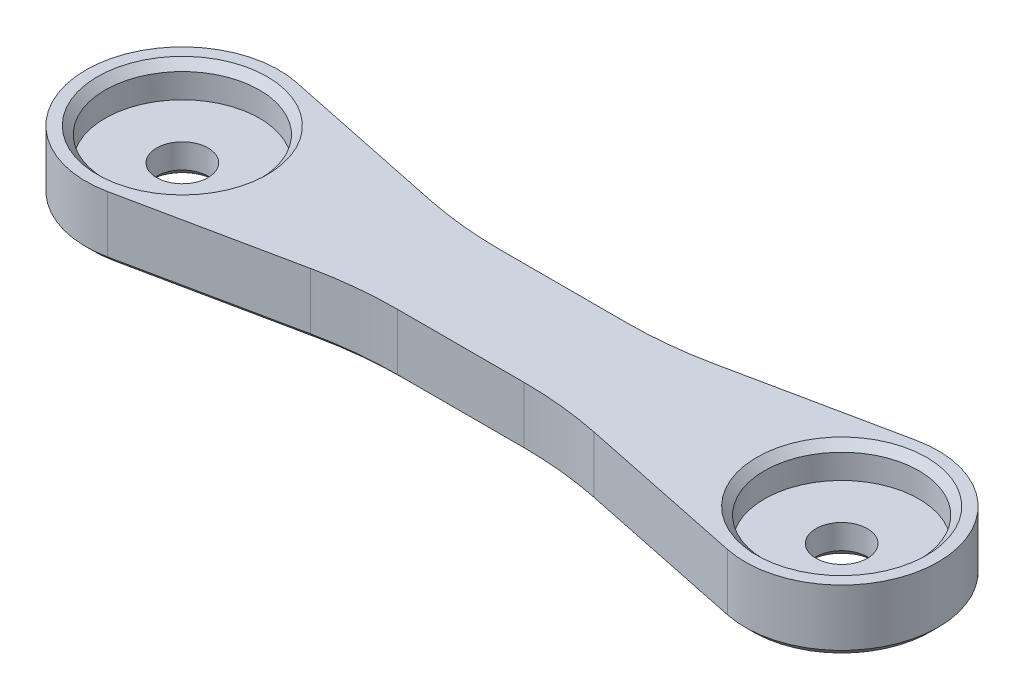
ISO-10303-21;
HEADER;
FILE_DESCRIPTION(('STEP AP214'),'2;1');
FILE_NAME('part.step','',(''),(''),'','','');
FILE_SCHEMA(('AUTOMOTIVE_DESIGN { 1 0 10303 214 1 1 1 1 }'));
ENDSEC;
DATA;
#1=APPLICATION_CONTEXT('core data for automotive mechanical design processes');
#2=APPLICATION_PROTOCOL_DEFINITION('international standard','automotive_design',2000,#1);
#3=PRODUCT_CONTEXT('',#1,'mechanical');
#4=PRODUCT('Part','Part','',(#3));
#5=PRODUCT_RELATED_PRODUCT_CATEGORY('part','',(#4));
#6=PRODUCT_DEFINITION_FORMATION('','',#4);
#7=PRODUCT_DEFINITION_CONTEXT('part definition',#1,'design');
#8=PRODUCT_DEFINITION('design','',#6,#7);
#9=PRODUCT_DEFINITION_SHAPE('','',#8);
#10=(LENGTH_UNIT() NAMED_UNIT(*) SI_UNIT(.MILLI.,.METRE.));
#11=(NAMED_UNIT(*) PLANE_ANGLE_UNIT() SI_UNIT($,.RADIAN.));
#12=(NAMED_UNIT(*) SI_UNIT($,.STERADIAN.) SOLID_ANGLE_UNIT());
#13=UNCERTAINTY_MEASURE_WITH_UNIT(LENGTH_MEASURE(1.E-05),#10,'distance_accuracy_value','');
#14=(GEOMETRIC_REPRESENTATION_CONTEXT(3) GLOBAL_UNCERTAINTY_ASSIGNED_CONTEXT((#13)) GLOBAL_UNIT_ASSIGNED_CONTEXT((#10,
#11,#12)) REPRESENTATION_CONTEXT('',''));
#15=CARTESIAN_POINT('',(0.,0.,0.));
#16=DIRECTION('',(0.,0.,1.));
#17=DIRECTION('',(1.,0.,0.));
#18=AXIS2_PLACEMENT_3D('',#15,#16,#17);
#19=CARTESIAN_POINT('',(-25.625,-5.,0.));
#20=DIRECTION('',(0.,1.,0.));
#21=DIRECTION('',(0.,0.,1.));
#22=AXIS2_PLACEMENT_3D('',#19,#20,#21);
#23=CYLINDRICAL_SURFACE('',#22,2.);
#24=CARTESIAN_POINT('',(-25.625,-4.39999999999999,0.));
#25=DIRECTION('',(0.,-1.,0.));
#26=DIRECTION('',(0.,0.,-1.));
#27=AXIS2_PLACEMENT_3D('',#24,#25,#26);
#28=CIRCLE('',#27,2.);
#29=CARTESIAN_POINT('',(-25.625,-4.39999999999999,-2.));
#30=VERTEX_POINT('',#29);
#31=EDGE_CURVE('E343',#30,#30,#28,.T.);
#32=ORIENTED_EDGE('',*,*,#31,.T.);
#33=EDGE_LOOP('',(#32));
#34=FACE_BOUND('',#33,.T.);
#35=CARTESIAN_POINT('',(-25.625,-2.5,0.));
#36=DIRECTION('',(0.,1.,0.));
#37=DIRECTION('',(0.,0.,1.));
#38=AXIS2_PLACEMENT_3D('',#35,#36,#37);
#39=CIRCLE('',#38,2.);
#40=CARTESIAN_POINT('',(-25.625,-2.5,2.00000000000001));
#41=VERTEX_POINT('',#40);
#42=EDGE_CURVE('E384',#41,#41,#39,.T.);
#43=ORIENTED_EDGE('',*,*,#42,.T.);
#44=EDGE_LOOP('',(#43));
#45=FACE_BOUND('',#44,.T.);
#46=ADVANCED_FACE('F91',(#34,#45),#23,.F.);
#47=CARTESIAN_POINT('',(25.625,-5.,0.));
#48=DIRECTION('',(0.,1.,0.));
#49=DIRECTION('',(0.,0.,1.));
#50=AXIS2_PLACEMENT_3D('',#47,#48,#49);
#51=CYLINDRICAL_SURFACE('',#50,2.);
#52=CARTESIAN_POINT('',(25.625,-4.39999999999999,0.));
#53=DIRECTION('',(0.,-1.,0.));
#54=DIRECTION('',(0.,0.,-1.));
#55=AXIS2_PLACEMENT_3D('',#52,#53,#54);
#56=CIRCLE('',#55,2.);
#57=CARTESIAN_POINT('',(25.625,-4.39999999999999,-2.));
#58=VERTEX_POINT('',#57);
#59=EDGE_CURVE('E346',#58,#58,#56,.T.);
#60=ORIENTED_EDGE('',*,*,#59,.T.);
#61=EDGE_LOOP('',(#60));
#62=FACE_BOUND('',#61,.T.);
#63=CARTESIAN_POINT('',(25.625,-2.5,0.));
#64=DIRECTION('',(0.,1.,0.));
#65=DIRECTION('',(0.,0.,1.));
#66=AXIS2_PLACEMENT_3D('',#63,#64,#65);
#67=CIRCLE('',#66,2.);
#68=CARTESIAN_POINT('',(25.625,-2.5,2.));
#69=VERTEX_POINT('',#68);
#70=EDGE_CURVE('E409',#69,#69,#67,.T.);
#71=ORIENTED_EDGE('',*,*,#70,.T.);
#72=EDGE_LOOP('',(#71));
#73=FACE_BOUND('',#72,.T.);
#74=ADVANCED_FACE('F438',(#62,#73),#51,.F.);
#75=CARTESIAN_POINT('',(-24.1000840869213,-5.,-7.34333925799695));
#76=DIRECTION('',(-0.203322121743827,0.,0.979111901066261));
#77=DIRECTION('',(0.979111901066261,0.,0.203322121743827));
#78=AXIS2_PLACEMENT_3D('',#75,#76,#77);
#79=PLANE('',#78);
#80=DIRECTION('',(0.,1.,0.));
#81=VECTOR('',#80,1.);
#82=CARTESIAN_POINT('',(-11.0176430505345,-5.,-4.62664296801217));
#83=LINE('',#82,#81);
#84=CARTESIAN_POINT('',(-11.0176430505345,0.,-4.62664296801216));
#85=VERTEX_POINT('',#84);
#86=CARTESIAN_POINT('',(-11.0176430505345,-4.4,-4.62664296801217));
#87=VERTEX_POINT('',#86);
#88=EDGE_CURVE('E270',#85,#87,#83,.F.);
#89=ORIENTED_EDGE('',*,*,#88,.T.);
#90=DIRECTION('',(-0.979111901066261,0.,-0.203322121743827));
#91=VECTOR('',#90,1.);
#92=CARTESIAN_POINT('',(-24.1000840869213,-4.4,-7.34333925799695));
#93=LINE('',#92,#91);
#94=CARTESIAN_POINT('',(-24.1000840869213,-4.4,-7.34333925799695));
#95=VERTEX_POINT('',#94);
#96=EDGE_CURVE('E341',#87,#95,#93,.T.);
#97=ORIENTED_EDGE('',*,*,#96,.T.);
#98=DIRECTION('',(0.,1.,0.));
#99=VECTOR('',#98,1.);
#100=CARTESIAN_POINT('',(-24.1000840869213,-5.,-7.34333925799695));
#101=LINE('',#100,#99);
#102=CARTESIAN_POINT('',(-24.1000840869213,0.,-7.34333925799695));
#103=VERTEX_POINT('',#102);
#104=EDGE_CURVE('E260',#95,#103,#101,.T.);
#105=ORIENTED_EDGE('',*,*,#104,.T.);
#106=DIRECTION('',(0.979111901066261,0.,0.203322121743827));
#107=VECTOR('',#106,1.);
#108=CARTESIAN_POINT('',(-24.1000840869213,0.,-7.34333925799695));
#109=LINE('',#108,#107);
#110=EDGE_CURVE('E246',#103,#85,#109,.T.);
#111=ORIENTED_EDGE('',*,*,#110,.T.);
#112=EDGE_LOOP('',(#89,#97,#105,#111));
#113=FACE_BOUND('',#112,.T.);
#114=ADVANCED_FACE('F444',(#113),#79,.F.);
#115=CARTESIAN_POINT('',(-8.,-5.,-4.));
#116=DIRECTION('',(0.,0.,1.));
#117=DIRECTION('',(1.,0.,0.));
#118=AXIS2_PLACEMENT_3D('',#115,#116,#117);
#119=PLANE('',#118);
#120=DIRECTION('',(0.,1.,0.));
#121=VECTOR('',#120,1.);
#122=CARTESIAN_POINT('',(4.9179793982197,-5.,-4.));
#123=LINE('',#122,#121);
#124=CARTESIAN_POINT('',(4.9179793982197,0.,-4.));
#125=VERTEX_POINT('',#124);
#126=CARTESIAN_POINT('',(4.9179793982197,-4.4,-4.));
#127=VERTEX_POINT('',#126);
#128=EDGE_CURVE('E268',#125,#127,#123,.F.);
#129=ORIENTED_EDGE('',*,*,#128,.T.);
#130=DIRECTION('',(-1.,0.,0.));
#131=VECTOR('',#130,1.);
#132=CARTESIAN_POINT('',(-4.91797939821971,-4.4,-4.));
#133=LINE('',#132,#131);
#134=CARTESIAN_POINT('',(-4.91797939821971,-4.4,-4.));
#135=VERTEX_POINT('',#134);
#136=EDGE_CURVE('E114',#127,#135,#133,.T.);
#137=ORIENTED_EDGE('',*,*,#136,.T.);
#138=DIRECTION('',(0.,1.,0.));
#139=VECTOR('',#138,1.);
#140=CARTESIAN_POINT('',(-4.91797939821971,0.,-4.));
#141=LINE('',#140,#139);
#142=CARTESIAN_POINT('',(-4.91797939821971,0.,-4.));
#143=VERTEX_POINT('',#142);
#144=EDGE_CURVE('E266',#135,#143,#141,.T.);
#145=ORIENTED_EDGE('',*,*,#144,.T.);
#146=DIRECTION('',(1.,0.,0.));
#147=VECTOR('',#146,1.);
#148=CARTESIAN_POINT('',(-8.,0.,-4.));
#149=LINE('',#148,#147);
#150=EDGE_CURVE('E243',#143,#125,#149,.T.);
#151=ORIENTED_EDGE('',*,*,#150,.T.);
#152=EDGE_LOOP('',(#129,#137,#145,#151));
#153=FACE_BOUND('',#152,.T.);
#154=ADVANCED_FACE('F474',(#153),#119,.F.);
#155=CARTESIAN_POINT('',(24.1000840869213,-5.,-7.34333925799698));
#156=DIRECTION('',(-0.203322121743828,0.,-0.979111901066261));
#157=DIRECTION('',(-0.979111901066261,0.,0.203322121743828));
#158=AXIS2_PLACEMENT_3D('',#155,#156,#157);
#159=PLANE('',#158);
#160=DIRECTION('',(0.,1.,0.));
#161=VECTOR('',#160,1.);
#162=CARTESIAN_POINT('',(24.1000840869213,-5.,-7.34333925799697));
#163=LINE('',#162,#161);
#164=CARTESIAN_POINT('',(24.1000840869213,-4.4,-7.34333925799697));
#165=VERTEX_POINT('',#164);
#166=CARTESIAN_POINT('',(24.1000840869213,0.,-7.34333925799697));
#167=VERTEX_POINT('',#166);
#168=EDGE_CURVE('E218',#165,#167,#163,.T.);
#169=ORIENTED_EDGE('',*,*,#168,.F.);
#170=DIRECTION('',(-0.979111901066261,0.,0.203322121743828));
#171=VECTOR('',#170,1.);
#172=CARTESIAN_POINT('',(24.1000840869213,-4.4,-7.34333925799698));
#173=LINE('',#172,#171);
#174=CARTESIAN_POINT('',(11.0176430505345,-4.4,-4.62664296801217));
#175=VERTEX_POINT('',#174);
#176=EDGE_CURVE('E335',#165,#175,#173,.T.);
#177=ORIENTED_EDGE('',*,*,#176,.T.);
#178=DIRECTION('',(0.,1.,0.));
#179=VECTOR('',#178,1.);
#180=CARTESIAN_POINT('',(11.0176430505345,-5.,-4.62664296801217));
#181=LINE('',#180,#179);
#182=CARTESIAN_POINT('',(11.0176430505345,0.,-4.62664296801217));
#183=VERTEX_POINT('',#182);
#184=EDGE_CURVE('E229',#175,#183,#181,.T.);
#185=ORIENTED_EDGE('',*,*,#184,.T.);
#186=DIRECTION('',(-0.979111901066261,0.,0.203322121743828));
#187=VECTOR('',#186,1.);
#188=CARTESIAN_POINT('',(24.1000840869213,0.,-7.34333925799698));
#189=LINE('',#188,#187);
#190=EDGE_CURVE('E236',#167,#183,#189,.T.);
#191=ORIENTED_EDGE('',*,*,#190,.F.);
#192=EDGE_LOOP('',(#169,#177,#185,#191));
#193=FACE_BOUND('',#192,.T.);
#194=ADVANCED_FACE('F240',(#193),#159,.T.);
#195=CARTESIAN_POINT('',(25.625,-5.,0.));
#196=DIRECTION('',(0.,1.,0.));
#197=DIRECTION('',(0.,0.,1.));
#198=AXIS2_PLACEMENT_3D('',#195,#196,#197);
#199=CYLINDRICAL_SURFACE('',#198,7.50000000000001);
#200=DIRECTION('',(0.,1.,0.));
#201=VECTOR('',#200,1.);
#202=CARTESIAN_POINT('',(24.1000840869213,-5.,7.34333925799696));
#203=LINE('',#202,#201);
#204=CARTESIAN_POINT('',(24.1000840869213,-4.4,7.34333925799696));
#205=VERTEX_POINT('',#204);
#206=CARTESIAN_POINT('',(24.1000840869213,0.,7.34333925799696));
#207=VERTEX_POINT('',#206);
#208=EDGE_CURVE('E230',#205,#207,#203,.T.);
#209=ORIENTED_EDGE('',*,*,#208,.F.);
#210=CARTESIAN_POINT('',(25.625,-4.4,0.));
#211=DIRECTION('',(0.,-1.,0.));
#212=DIRECTION('',(0.,0.,-1.));
#213=AXIS2_PLACEMENT_3D('',#210,#211,#212);
#214=CIRCLE('',#213,7.50000000000001);
#215=EDGE_CURVE('E225',#205,#165,#214,.F.);
#216=ORIENTED_EDGE('',*,*,#215,.T.);
#217=ORIENTED_EDGE('',*,*,#168,.T.);
#218=CARTESIAN_POINT('',(25.625,0.,0.));
#219=DIRECTION('',(0.,-1.,0.));
#220=DIRECTION('',(0.,0.,-1.));
#221=AXIS2_PLACEMENT_3D('',#218,#219,#220);
#222=CIRCLE('',#221,7.50000000000001);
#223=EDGE_CURVE('E222',#167,#207,#222,.T.);
#224=ORIENTED_EDGE('',*,*,#223,.T.);
#225=EDGE_LOOP('',(#209,#216,#217,#224));
#226=FACE_BOUND('',#225,.T.);
#227=ADVANCED_FACE('F221',(#226),#199,.T.);
#228=CARTESIAN_POINT('',(24.1000840869213,-5.,7.34333925799696));
#229=DIRECTION('',(0.203322121743827,0.,-0.979111901066261));
#230=DIRECTION('',(-0.979111901066261,0.,-0.203322121743827));
#231=AXIS2_PLACEMENT_3D('',#228,#229,#230);
#232=PLANE('',#231);
#233=DIRECTION('',(0.,1.,0.));
#234=VECTOR('',#233,1.);
#235=CARTESIAN_POINT('',(11.0176430505345,-5.,4.62664296801215));
#236=LINE('',#235,#234);
#237=CARTESIAN_POINT('',(11.0176430505345,0.,4.62664296801216));
#238=VERTEX_POINT('',#237);
#239=CARTESIAN_POINT('',(11.0176430505345,-4.4,4.62664296801215));
#240=VERTEX_POINT('',#239);
#241=EDGE_CURVE('E277',#238,#240,#236,.F.);
#242=ORIENTED_EDGE('',*,*,#241,.T.);
#243=DIRECTION('',(0.979111901066261,0.,0.203322121743827));
#244=VECTOR('',#243,1.);
#245=CARTESIAN_POINT('',(24.1000840869213,-4.4,7.34333925799696));
#246=LINE('',#245,#244);
#247=EDGE_CURVE('E332',#240,#205,#246,.T.);
#248=ORIENTED_EDGE('',*,*,#247,.T.);
#249=ORIENTED_EDGE('',*,*,#208,.T.);
#250=DIRECTION('',(-0.979111901066261,0.,-0.203322121743827));
#251=VECTOR('',#250,1.);
#252=CARTESIAN_POINT('',(24.1000840869213,0.,7.34333925799696));
#253=LINE('',#252,#251);
#254=EDGE_CURVE('E238',#207,#238,#253,.T.);
#255=ORIENTED_EDGE('',*,*,#254,.T.);
#256=EDGE_LOOP('',(#242,#248,#249,#255));
#257=FACE_BOUND('',#256,.T.);
#258=ADVANCED_FACE('F465',(#257),#232,.F.);
#259=CARTESIAN_POINT('',(8.,-5.,4.));
#260=DIRECTION('',(0.,0.,-1.));
#261=DIRECTION('',(-1.,0.,0.));
#262=AXIS2_PLACEMENT_3D('',#259,#260,#261);
#263=PLANE('',#262);
#264=DIRECTION('',(0.,1.,0.));
#265=VECTOR('',#264,1.);
#266=CARTESIAN_POINT('',(-4.91797939821969,-5.,4.));
#267=LINE('',#266,#265);
#268=CARTESIAN_POINT('',(-4.91797939821969,0.,4.));
#269=VERTEX_POINT('',#268);
#270=CARTESIAN_POINT('',(-4.91797939821969,-4.4,4.));
#271=VERTEX_POINT('',#270);
#272=EDGE_CURVE('E272',#269,#271,#267,.F.);
#273=ORIENTED_EDGE('',*,*,#272,.T.);
#274=DIRECTION('',(1.,0.,0.));
#275=VECTOR('',#274,1.);
#276=CARTESIAN_POINT('',(4.91797939821968,-4.4,4.));
#277=LINE('',#276,#275);
#278=CARTESIAN_POINT('',(4.91797939821968,-4.4,4.));
#279=VERTEX_POINT('',#278);
#280=EDGE_CURVE('E328',#271,#279,#277,.T.);
#281=ORIENTED_EDGE('',*,*,#280,.T.);
#282=DIRECTION('',(0.,1.,0.));
#283=VECTOR('',#282,1.);
#284=CARTESIAN_POINT('',(4.91797939821968,0.,4.));
#285=LINE('',#284,#283);
#286=CARTESIAN_POINT('',(4.91797939821968,0.,4.));
#287=VERTEX_POINT('',#286);
#288=EDGE_CURVE('E275',#279,#287,#285,.T.);
#289=ORIENTED_EDGE('',*,*,#288,.T.);
#290=DIRECTION('',(-1.,0.,0.));
#291=VECTOR('',#290,1.);
#292=CARTESIAN_POINT('',(8.,0.,4.));
#293=LINE('',#292,#291);
#294=EDGE_CURVE('E251',#287,#269,#293,.T.);
#295=ORIENTED_EDGE('',*,*,#294,.T.);
#296=EDGE_LOOP('',(#273,#281,#289,#295));
#297=FACE_BOUND('',#296,.T.);
#298=ADVANCED_FACE('F461',(#297),#263,.F.);
#299=CARTESIAN_POINT('',(-24.1000840869213,-5.,7.34333925799697));
#300=DIRECTION('',(0.203322121743828,0.,0.979111901066261));
#301=DIRECTION('',(0.979111901066261,0.,-0.203322121743828));
#302=AXIS2_PLACEMENT_3D('',#299,#300,#301);
#303=PLANE('',#302);
#304=DIRECTION('',(0.,1.,0.));
#305=VECTOR('',#304,1.);
#306=CARTESIAN_POINT('',(-24.1000840869213,-5.,7.34333925799697));
#307=LINE('',#306,#305);
#308=CARTESIAN_POINT('',(-24.1000840869213,-4.4,7.34333925799697));
#309=VERTEX_POINT('',#308);
#310=CARTESIAN_POINT('',(-24.1000840869213,0.,7.34333925799697));
#311=VERTEX_POINT('',#310);
#312=EDGE_CURVE('E262',#309,#311,#307,.T.);
#313=ORIENTED_EDGE('',*,*,#312,.F.);
#314=DIRECTION('',(0.979111901066261,0.,-0.203322121743828));
#315=VECTOR('',#314,1.);
#316=CARTESIAN_POINT('',(-24.1000840869213,-4.4,7.34333925799697));
#317=LINE('',#316,#315);
#318=CARTESIAN_POINT('',(-11.0176430505345,-4.4,4.62664296801217));
#319=VERTEX_POINT('',#318);
#320=EDGE_CURVE('E324',#309,#319,#317,.T.);
#321=ORIENTED_EDGE('',*,*,#320,.T.);
#322=DIRECTION('',(0.,1.,0.));
#323=VECTOR('',#322,1.);
#324=CARTESIAN_POINT('',(-11.0176430505345,-5.,4.62664296801217));
#325=LINE('',#324,#323);
#326=CARTESIAN_POINT('',(-11.0176430505345,0.,4.62664296801217));
#327=VERTEX_POINT('',#326);
#328=EDGE_CURVE('E280',#319,#327,#325,.T.);
#329=ORIENTED_EDGE('',*,*,#328,.T.);
#330=DIRECTION('',(0.979111901066261,0.,-0.203322121743828));
#331=VECTOR('',#330,1.);
#332=CARTESIAN_POINT('',(-24.1000840869213,0.,7.34333925799697));
#333=LINE('',#332,#331);
#334=EDGE_CURVE('E254',#311,#327,#333,.T.);
#335=ORIENTED_EDGE('',*,*,#334,.F.);
#336=EDGE_LOOP('',(#313,#321,#329,#335));
#337=FACE_BOUND('',#336,.T.);
#338=ADVANCED_FACE('F457',(#337),#303,.T.);
#339=CARTESIAN_POINT('',(-25.625,-5.,0.));
#340=DIRECTION('',(0.,1.,0.));
#341=DIRECTION('',(0.,0.,1.));
#342=AXIS2_PLACEMENT_3D('',#339,#340,#341);
#343=CYLINDRICAL_SURFACE('',#342,7.5);
#344=ORIENTED_EDGE('',*,*,#104,.F.);
#345=CARTESIAN_POINT('',(-25.625,-4.4,0.));
#346=DIRECTION('',(0.,-1.,0.));
#347=DIRECTION('',(0.,0.,-1.));
#348=AXIS2_PLACEMENT_3D('',#345,#346,#347);
#349=CIRCLE('',#348,7.5);
#350=EDGE_CURVE('E290',#95,#309,#349,.F.);
#351=ORIENTED_EDGE('',*,*,#350,.T.);
#352=ORIENTED_EDGE('',*,*,#312,.T.);
#353=CARTESIAN_POINT('',(-25.625,0.,0.));
#354=DIRECTION('',(0.,1.,0.));
#355=DIRECTION('',(0.,0.,1.));
#356=AXIS2_PLACEMENT_3D('',#353,#354,#355);
#357=CIRCLE('',#356,7.5);
#358=EDGE_CURVE('E257',#103,#311,#357,.T.);
#359=ORIENTED_EDGE('',*,*,#358,.F.);
#360=EDGE_LOOP('',(#344,#351,#352,#359));
#361=FACE_BOUND('',#360,.T.);
#362=ADVANCED_FACE('F451',(#361),#343,.T.);
#363=CARTESIAN_POINT('',(25.625,-5.,0.));
#364=DIRECTION('',(0.,-1.,0.));
#365=DIRECTION('',(0.,0.,-1.));
#366=AXIS2_PLACEMENT_3D('',#363,#364,#365);
#367=PLANE('',#366);
#368=DIRECTION('',(-0.979111901066261,0.,0.203322121743828));
#369=VECTOR('',#368,1.);
#370=CARTESIAN_POINT('',(24.9092535240238,-5.,-3.44672722655084));
#371=LINE('',#370,#369);
#372=CARTESIAN_POINT('',(-11.1396363235808,-5.,4.03917582737241));
#373=VERTEX_POINT('',#372);
#374=CARTESIAN_POINT('',(-24.2220773599676,-5.,6.75587211735721));
#375=VERTEX_POINT('',#374);
#376=EDGE_CURVE('E319',#373,#375,#371,.T.);
#377=ORIENTED_EDGE('',*,*,#376,.T.);
#378=CARTESIAN_POINT('',(-25.625,-5.,0.));
#379=DIRECTION('',(0.,-1.,0.));
#380=DIRECTION('',(0.,0.,-1.));
#381=AXIS2_PLACEMENT_3D('',#378,#379,#380);
#382=CIRCLE('',#381,6.9);
#383=CARTESIAN_POINT('',(-24.2220773599676,-5.,-6.7558721173572));
#384=VERTEX_POINT('',#383);
#385=EDGE_CURVE('E321',#375,#384,#382,.T.);
#386=ORIENTED_EDGE('',*,*,#385,.T.);
#387=DIRECTION('',(0.979111901066261,0.,0.203322121743827));
#388=VECTOR('',#387,1.);
#389=CARTESIAN_POINT('',(-11.1396363235808,-5.,-4.03917582737241));
#390=LINE('',#389,#388);
#391=CARTESIAN_POINT('',(-11.1396363235808,-5.,-4.03917582737241));
#392=VERTEX_POINT('',#391);
#393=EDGE_CURVE('E299',#384,#392,#390,.T.);
#394=ORIENTED_EDGE('',*,*,#393,.T.);
#395=CARTESIAN_POINT('',(-4.91797939821972,-5.,-34.));
#396=DIRECTION('',(0.,-1.,0.));
#397=DIRECTION('',(0.,0.,-1.));
#398=AXIS2_PLACEMENT_3D('',#395,#396,#397);
#399=CIRCLE('',#398,30.6);
#400=CARTESIAN_POINT('',(-4.91797939821971,-5.,-3.4));
#401=VERTEX_POINT('',#400);
#402=EDGE_CURVE('E301',#392,#401,#399,.F.);
#403=ORIENTED_EDGE('',*,*,#402,.T.);
#404=DIRECTION('',(1.,0.,0.));
#405=VECTOR('',#404,1.);
#406=CARTESIAN_POINT('',(4.9179793982197,-5.,-3.4));
#407=LINE('',#406,#405);
#408=CARTESIAN_POINT('',(4.9179793982197,-5.,-3.4));
#409=VERTEX_POINT('',#408);
#410=EDGE_CURVE('E303',#401,#409,#407,.T.);
#411=ORIENTED_EDGE('',*,*,#410,.T.);
#412=CARTESIAN_POINT('',(4.91797939821969,-5.,-34.));
#413=DIRECTION('',(0.,-1.,0.));
#414=DIRECTION('',(0.,0.,-1.));
#415=AXIS2_PLACEMENT_3D('',#412,#413,#414);
#416=CIRCLE('',#415,30.6);
#417=CARTESIAN_POINT('',(11.1396363235808,-5.,-4.03917582737241));
#418=VERTEX_POINT('',#417);
#419=EDGE_CURVE('E305',#409,#418,#416,.F.);
#420=ORIENTED_EDGE('',*,*,#419,.T.);
#421=DIRECTION('',(0.979111901066261,0.,-0.203322121743828));
#422=VECTOR('',#421,1.);
#423=CARTESIAN_POINT('',(24.2220773599676,-5.,-6.75587211735722));
#424=LINE('',#423,#422);
#425=CARTESIAN_POINT('',(24.2220773599676,-5.,-6.75587211735722));
#426=VERTEX_POINT('',#425);
#427=EDGE_CURVE('E307',#418,#426,#424,.T.);
#428=ORIENTED_EDGE('',*,*,#427,.T.);
#429=CARTESIAN_POINT('',(25.625,-5.,0.));
#430=DIRECTION('',(0.,-1.,0.));
#431=DIRECTION('',(0.,0.,-1.));
#432=AXIS2_PLACEMENT_3D('',#429,#430,#431);
#433=CIRCLE('',#432,6.90000000000001);
#434=CARTESIAN_POINT('',(24.2220773599676,-5.,6.75587211735721));
#435=VERTEX_POINT('',#434);
#436=EDGE_CURVE('E309',#426,#435,#433,.T.);
#437=ORIENTED_EDGE('',*,*,#436,.T.);
#438=DIRECTION('',(-0.979111901066261,0.,-0.203322121743827));
#439=VECTOR('',#438,1.);
#440=CARTESIAN_POINT('',(11.1396363235808,-5.,4.0391758273724));
#441=LINE('',#440,#439);
#442=CARTESIAN_POINT('',(11.1396363235808,-5.,4.0391758273724));
#443=VERTEX_POINT('',#442);
#444=EDGE_CURVE('E311',#435,#443,#441,.T.);
#445=ORIENTED_EDGE('',*,*,#444,.T.);
#446=CARTESIAN_POINT('',(4.91797939821969,-5.,34.));
#447=DIRECTION('',(0.,-1.,0.));
#448=DIRECTION('',(0.,0.,-1.));
#449=AXIS2_PLACEMENT_3D('',#446,#447,#448);
#450=CIRCLE('',#449,30.6);
#451=CARTESIAN_POINT('',(4.91797939821968,-5.,3.39999999999999));
#452=VERTEX_POINT('',#451);
#453=EDGE_CURVE('E313',#443,#452,#450,.F.);
#454=ORIENTED_EDGE('',*,*,#453,.T.);
#455=DIRECTION('',(-1.,0.,0.));
#456=VECTOR('',#455,1.);
#457=CARTESIAN_POINT('',(-4.91797939821969,-5.,3.4));
#458=LINE('',#457,#456);
#459=CARTESIAN_POINT('',(-4.91797939821969,-5.,3.4));
#460=VERTEX_POINT('',#459);
#461=EDGE_CURVE('E315',#452,#460,#458,.T.);
#462=ORIENTED_EDGE('',*,*,#461,.T.);
#463=CARTESIAN_POINT('',(-4.91797939821968,-5.,34.));
#464=DIRECTION('',(0.,-1.,0.));
#465=DIRECTION('',(0.,0.,-1.));
#466=AXIS2_PLACEMENT_3D('',#463,#464,#465);
#467=CIRCLE('',#466,30.6);
#468=EDGE_CURVE('E317',#460,#373,#467,.F.);
#469=ORIENTED_EDGE('',*,*,#468,.T.);
#470=EDGE_LOOP('',(#377,#386,#394,#403,#411,#420,#428,#437,#445,#454,#462,#469));
#471=FACE_BOUND('',#470,.T.);
#472=CARTESIAN_POINT('',(-25.625,-5.,0.));
#473=DIRECTION('',(0.,-1.,0.));
#474=DIRECTION('',(0.,0.,-1.));
#475=AXIS2_PLACEMENT_3D('',#472,#473,#474);
#476=CIRCLE('',#475,2.6);
#477=CARTESIAN_POINT('',(-25.625,-5.,-2.6));
#478=VERTEX_POINT('',#477);
#479=EDGE_CURVE('E296',#478,#478,#476,.F.);
#480=ORIENTED_EDGE('',*,*,#479,.T.);
#481=EDGE_LOOP('',(#480));
#482=FACE_BOUND('',#481,.T.);
#483=CARTESIAN_POINT('',(25.625,-5.,0.));
#484=DIRECTION('',(0.,-1.,0.));
#485=DIRECTION('',(0.,0.,-1.));
#486=AXIS2_PLACEMENT_3D('',#483,#484,#485);
#487=CIRCLE('',#486,2.6);
#488=CARTESIAN_POINT('',(25.625,-5.,-2.60000000000001));
#489=VERTEX_POINT('',#488);
#490=EDGE_CURVE('E293',#489,#489,#487,.F.);
#491=ORIENTED_EDGE('',*,*,#490,.T.);
#492=EDGE_LOOP('',(#491));
#493=FACE_BOUND('',#492,.T.);
#494=ADVANCED_FACE('F448',(#471,#482,#493),#367,.T.);
#495=CARTESIAN_POINT('',(25.625,0.,0.));
#496=DIRECTION('',(0.,-1.,0.));
#497=DIRECTION('',(0.,0.,-1.));
#498=AXIS2_PLACEMENT_3D('',#495,#496,#497);
#499=PLANE('',#498);
#500=CARTESIAN_POINT('',(25.625,0.,0.));
#501=DIRECTION('',(0.,-1.,0.));
#502=DIRECTION('',(0.,0.,-1.));
#503=AXIS2_PLACEMENT_3D('',#500,#501,#502);
#504=CIRCLE('',#503,6.60000000000001);
#505=CARTESIAN_POINT('',(25.625,0.,-6.60000000000001));
#506=VERTEX_POINT('',#505);
#507=EDGE_CURVE('E99',#506,#506,#504,.T.);
#508=ORIENTED_EDGE('',*,*,#507,.T.);
#509=EDGE_LOOP('',(#508));
#510=FACE_BOUND('',#509,.T.);
#511=CARTESIAN_POINT('',(-25.625,0.,0.));
#512=DIRECTION('',(0.,-1.,0.));
#513=DIRECTION('',(0.,0.,-1.));
#514=AXIS2_PLACEMENT_3D('',#511,#512,#513);
#515=CIRCLE('',#514,6.59999999999999);
#516=CARTESIAN_POINT('',(-25.625,0.,-6.59999999999998));
#517=VERTEX_POINT('',#516);
#518=EDGE_CURVE('E387',#517,#517,#515,.T.);
#519=ORIENTED_EDGE('',*,*,#518,.T.);
#520=EDGE_LOOP('',(#519));
#521=FACE_BOUND('',#520,.T.);
#522=ORIENTED_EDGE('',*,*,#110,.F.);
#523=ORIENTED_EDGE('',*,*,#358,.T.);
#524=ORIENTED_EDGE('',*,*,#334,.T.);
#525=CARTESIAN_POINT('',(-4.91797939821968,0.,34.));
#526=DIRECTION('',(0.,-1.,0.));
#527=DIRECTION('',(0.,0.,-1.));
#528=AXIS2_PLACEMENT_3D('',#525,#526,#527);
#529=CIRCLE('',#528,30.);
#530=EDGE_CURVE('E288',#327,#269,#529,.T.);
#531=ORIENTED_EDGE('',*,*,#530,.T.);
#532=ORIENTED_EDGE('',*,*,#294,.F.);
#533=CARTESIAN_POINT('',(4.91797939821969,0.,34.));
#534=DIRECTION('',(0.,-1.,0.));
#535=DIRECTION('',(0.,0.,-1.));
#536=AXIS2_PLACEMENT_3D('',#533,#534,#535);
#537=CIRCLE('',#536,30.);
#538=EDGE_CURVE('E286',#287,#238,#537,.T.);
#539=ORIENTED_EDGE('',*,*,#538,.T.);
#540=ORIENTED_EDGE('',*,*,#254,.F.);
#541=ORIENTED_EDGE('',*,*,#223,.F.);
#542=ORIENTED_EDGE('',*,*,#190,.T.);
#543=CARTESIAN_POINT('',(4.91797939821969,0.,-34.));
#544=DIRECTION('',(0.,-1.,0.));
#545=DIRECTION('',(0.,0.,-1.));
#546=AXIS2_PLACEMENT_3D('',#543,#544,#545);
#547=CIRCLE('',#546,30.);
#548=EDGE_CURVE('E282',#183,#125,#547,.T.);
#549=ORIENTED_EDGE('',*,*,#548,.T.);
#550=ORIENTED_EDGE('',*,*,#150,.F.);
#551=CARTESIAN_POINT('',(-4.91797939821972,0.,-34.));
#552=DIRECTION('',(0.,-1.,0.));
#553=DIRECTION('',(0.,0.,-1.));
#554=AXIS2_PLACEMENT_3D('',#551,#552,#553);
#555=CIRCLE('',#554,30.);
#556=EDGE_CURVE('E284',#143,#85,#555,.T.);
#557=ORIENTED_EDGE('',*,*,#556,.T.);
#558=EDGE_LOOP('',(#522,#523,#524,#531,#532,#539,#540,#541,#542,#549,#550,#557));
#559=FACE_BOUND('',#558,.T.);
#560=ADVANCED_FACE('F235',(#510,#521,#559),#499,.F.);
#561=CARTESIAN_POINT('',(25.625,-2.5,0.));
#562=DIRECTION('',(0.,1.,0.));
#563=DIRECTION('',(0.,0.,1.));
#564=AXIS2_PLACEMENT_3D('',#561,#562,#563);
#565=CYLINDRICAL_SURFACE('',#564,6.00000000000001);
#566=CARTESIAN_POINT('',(25.625,-0.599999999999996,0.));
#567=DIRECTION('',(0.,-1.,0.));
#568=DIRECTION('',(0.,0.,-1.));
#569=AXIS2_PLACEMENT_3D('',#566,#567,#568);
#570=CIRCLE('',#569,6.00000000000001);
#571=CARTESIAN_POINT('',(25.625,-0.599999999999996,-6.00000000000001));
#572=VERTEX_POINT('',#571);
#573=EDGE_CURVE('E349',#572,#572,#570,.F.);
#574=ORIENTED_EDGE('',*,*,#573,.T.);
#575=EDGE_LOOP('',(#574));
#576=FACE_BOUND('',#575,.T.);
#577=CARTESIAN_POINT('',(25.625,-2.5,0.));
#578=DIRECTION('',(0.,1.,0.));
#579=DIRECTION('',(0.,0.,1.));
#580=AXIS2_PLACEMENT_3D('',#577,#578,#579);
#581=CIRCLE('',#580,6.00000000000001);
#582=CARTESIAN_POINT('',(25.625,-2.5,6.));
#583=VERTEX_POINT('',#582);
#584=EDGE_CURVE('E407',#583,#583,#581,.T.);
#585=ORIENTED_EDGE('',*,*,#584,.F.);
#586=EDGE_LOOP('',(#585));
#587=FACE_BOUND('',#586,.T.);
#588=ADVANCED_FACE('F400',(#576,#587),#565,.F.);
#589=CARTESIAN_POINT('',(0.,-2.5,0.));
#590=DIRECTION('',(0.,1.,0.));
#591=DIRECTION('',(0.,0.,1.));
#592=AXIS2_PLACEMENT_3D('',#589,#590,#591);
#593=PLANE('',#592);
#594=ORIENTED_EDGE('',*,*,#70,.F.);
#595=EDGE_LOOP('',(#594));
#596=FACE_BOUND('',#595,.T.);
#597=ORIENTED_EDGE('',*,*,#584,.T.);
#598=EDGE_LOOP('',(#597));
#599=FACE_BOUND('',#598,.T.);
#600=ADVANCED_FACE('F403',(#596,#599),#593,.T.);
#601=CARTESIAN_POINT('',(-25.625,-2.5,0.));
#602=DIRECTION('',(0.,1.,0.));
#603=DIRECTION('',(0.,0.,1.));
#604=AXIS2_PLACEMENT_3D('',#601,#602,#603);
#605=CYLINDRICAL_SURFACE('',#604,6.);
#606=CARTESIAN_POINT('',(-25.625,-0.599999999999978,0.));
#607=DIRECTION('',(0.,-1.,0.));
#608=DIRECTION('',(0.,0.,-1.));
#609=AXIS2_PLACEMENT_3D('',#606,#607,#608);
#610=CIRCLE('',#609,6.);
#611=CARTESIAN_POINT('',(-25.625,-0.599999999999978,-5.99999999999999));
#612=VERTEX_POINT('',#611);
#613=EDGE_CURVE('E12',#612,#612,#610,.F.);
#614=ORIENTED_EDGE('',*,*,#613,.T.);
#615=EDGE_LOOP('',(#614));
#616=FACE_BOUND('',#615,.T.);
#617=CARTESIAN_POINT('',(-25.625,-2.5,0.));
#618=DIRECTION('',(0.,1.,0.));
#619=DIRECTION('',(0.,0.,1.));
#620=AXIS2_PLACEMENT_3D('',#617,#618,#619);
#621=CIRCLE('',#620,6.);
#622=CARTESIAN_POINT('',(-25.625,-2.5,6.00000000000001));
#623=VERTEX_POINT('',#622);
#624=EDGE_CURVE('E413',#623,#623,#621,.T.);
#625=ORIENTED_EDGE('',*,*,#624,.F.);
#626=EDGE_LOOP('',(#625));
#627=FACE_BOUND('',#626,.T.);
#628=ADVANCED_FACE('F423',(#616,#627),#605,.F.);
#629=CARTESIAN_POINT('',(0.,-2.5,0.));
#630=DIRECTION('',(0.,1.,0.));
#631=DIRECTION('',(0.,0.,1.));
#632=AXIS2_PLACEMENT_3D('',#629,#630,#631);
#633=PLANE('',#632);
#634=ORIENTED_EDGE('',*,*,#42,.F.);
#635=EDGE_LOOP('',(#634));
#636=FACE_BOUND('',#635,.T.);
#637=ORIENTED_EDGE('',*,*,#624,.T.);
#638=EDGE_LOOP('',(#637));
#639=FACE_BOUND('',#638,.T.);
#640=ADVANCED_FACE('F421',(#636,#639),#633,.T.);
#641=CARTESIAN_POINT('',(4.91797939821969,-5.,-34.));
#642=DIRECTION('',(0.,1.,0.));
#643=DIRECTION('',(0.,0.,1.));
#644=AXIS2_PLACEMENT_3D('',#641,#642,#643);
#645=CYLINDRICAL_SURFACE('',#644,30.);
#646=ORIENTED_EDGE('',*,*,#184,.F.);
#647=CARTESIAN_POINT('',(4.91797939821969,-4.4,-34.));
#648=DIRECTION('',(0.,-1.,0.));
#649=DIRECTION('',(0.,0.,-1.));
#650=AXIS2_PLACEMENT_3D('',#647,#648,#649);
#651=CIRCLE('',#650,30.);
#652=EDGE_CURVE('E337',#175,#127,#651,.T.);
#653=ORIENTED_EDGE('',*,*,#652,.T.);
#654=ORIENTED_EDGE('',*,*,#128,.F.);
#655=ORIENTED_EDGE('',*,*,#548,.F.);
#656=EDGE_LOOP('',(#646,#653,#654,#655));
#657=FACE_BOUND('',#656,.T.);
#658=ADVANCED_FACE('F431',(#657),#645,.F.);
#659=CARTESIAN_POINT('',(-4.91797939821972,-5.,-34.));
#660=DIRECTION('',(0.,-1.,0.));
#661=DIRECTION('',(0.,0.,-1.));
#662=AXIS2_PLACEMENT_3D('',#659,#660,#661);
#663=CYLINDRICAL_SURFACE('',#662,30.);
#664=ORIENTED_EDGE('',*,*,#144,.F.);
#665=CARTESIAN_POINT('',(-4.91797939821972,-4.4,-34.));
#666=DIRECTION('',(0.,-1.,0.));
#667=DIRECTION('',(0.,0.,-1.));
#668=AXIS2_PLACEMENT_3D('',#665,#666,#667);
#669=CIRCLE('',#668,30.);
#670=EDGE_CURVE('E106',#135,#87,#669,.T.);
#671=ORIENTED_EDGE('',*,*,#670,.T.);
#672=ORIENTED_EDGE('',*,*,#88,.F.);
#673=ORIENTED_EDGE('',*,*,#556,.F.);
#674=EDGE_LOOP('',(#664,#671,#672,#673));
#675=FACE_BOUND('',#674,.T.);
#676=ADVANCED_FACE('F482',(#675),#663,.F.);
#677=CARTESIAN_POINT('',(4.91797939821969,-5.,34.));
#678=DIRECTION('',(0.,-1.,0.));
#679=DIRECTION('',(0.,0.,-1.));
#680=AXIS2_PLACEMENT_3D('',#677,#678,#679);
#681=CYLINDRICAL_SURFACE('',#680,30.);
#682=ORIENTED_EDGE('',*,*,#288,.F.);
#683=CARTESIAN_POINT('',(4.91797939821969,-4.4,34.));
#684=DIRECTION('',(0.,-1.,0.));
#685=DIRECTION('',(0.,0.,-1.));
#686=AXIS2_PLACEMENT_3D('',#683,#684,#685);
#687=CIRCLE('',#686,30.);
#688=EDGE_CURVE('E330',#279,#240,#687,.T.);
#689=ORIENTED_EDGE('',*,*,#688,.T.);
#690=ORIENTED_EDGE('',*,*,#241,.F.);
#691=ORIENTED_EDGE('',*,*,#538,.F.);
#692=EDGE_LOOP('',(#682,#689,#690,#691));
#693=FACE_BOUND('',#692,.T.);
#694=ADVANCED_FACE('F486',(#693),#681,.F.);
#695=CARTESIAN_POINT('',(-4.91797939821968,-5.,34.));
#696=DIRECTION('',(0.,1.,0.));
#697=DIRECTION('',(0.,0.,1.));
#698=AXIS2_PLACEMENT_3D('',#695,#696,#697);
#699=CYLINDRICAL_SURFACE('',#698,30.);
#700=ORIENTED_EDGE('',*,*,#328,.F.);
#701=CARTESIAN_POINT('',(-4.91797939821968,-4.4,34.));
#702=DIRECTION('',(0.,-1.,0.));
#703=DIRECTION('',(0.,0.,-1.));
#704=AXIS2_PLACEMENT_3D('',#701,#702,#703);
#705=CIRCLE('',#704,30.);
#706=EDGE_CURVE('E326',#319,#271,#705,.T.);
#707=ORIENTED_EDGE('',*,*,#706,.T.);
#708=ORIENTED_EDGE('',*,*,#272,.F.);
#709=ORIENTED_EDGE('',*,*,#530,.F.);
#710=EDGE_LOOP('',(#700,#707,#708,#709));
#711=FACE_BOUND('',#710,.T.);
#712=ADVANCED_FACE('F489',(#711),#699,.F.);
#713=CARTESIAN_POINT('',(25.625,-5.,0.));
#714=DIRECTION('',(0.,1.,0.));
#715=DIRECTION('',(0.,0.,1.));
#716=AXIS2_PLACEMENT_3D('',#713,#714,#715);
#717=CONICAL_SURFACE('',#716,6.90000000000001,0.785398163397447);
#718=DIRECTION('',(-0.143770451050299,0.707106781186549,0.692336664784404));
#719=VECTOR('',#718,1.);
#720=CARTESIAN_POINT('',(24.2220773599676,-5.,6.75587211735721));
#721=LINE('',#720,#719);
#722=EDGE_CURVE('E378',#435,#205,#721,.T.);
#723=ORIENTED_EDGE('',*,*,#722,.F.);
#724=ORIENTED_EDGE('',*,*,#436,.F.);
#725=DIRECTION('',(0.143770451050299,-0.707106781186549,0.692336664784404));
#726=VECTOR('',#725,1.);
#727=CARTESIAN_POINT('',(24.1000840869213,-4.4,-7.34333925799697));
#728=LINE('',#727,#726);
#729=EDGE_CURVE('E381',#165,#426,#728,.T.);
#730=ORIENTED_EDGE('',*,*,#729,.F.);
#731=ORIENTED_EDGE('',*,*,#215,.F.);
#732=EDGE_LOOP('',(#723,#724,#730,#731));
#733=FACE_BOUND('',#732,.T.);
#734=ADVANCED_FACE('F493',(#733),#717,.T.);
#735=CARTESIAN_POINT('',(24.1000840869213,-4.4,-7.34333925799698));
#736=DIRECTION('',(0.143770451050298,0.707106781186547,0.692336664784406));
#737=DIRECTION('',(-0.979111901066261,0.,0.203322121743828));
#738=AXIS2_PLACEMENT_3D('',#735,#736,#737);
#739=PLANE('',#738);
#740=ORIENTED_EDGE('',*,*,#729,.T.);
#741=ORIENTED_EDGE('',*,*,#427,.F.);
#742=DIRECTION('',(0.143770451050297,-0.707106781186549,0.692336664784404));
#743=VECTOR('',#742,1.);
#744=CARTESIAN_POINT('',(11.0176430505345,-4.4,-4.62664296801217));
#745=LINE('',#744,#743);
#746=EDGE_CURVE('E375',#175,#418,#745,.T.);
#747=ORIENTED_EDGE('',*,*,#746,.F.);
#748=ORIENTED_EDGE('',*,*,#176,.F.);
#749=EDGE_LOOP('',(#740,#741,#747,#748));
#750=FACE_BOUND('',#749,.T.);
#751=ADVANCED_FACE('F535',(#750),#739,.F.);
#752=CARTESIAN_POINT('',(24.2220773599676,-5.,6.7558721173572));
#753=DIRECTION('',(-0.143770451050297,-0.707106781186547,0.692336664784406));
#754=DIRECTION('',(0.979111901066261,0.,0.203322121743827));
#755=AXIS2_PLACEMENT_3D('',#752,#753,#754);
#756=PLANE('',#755);
#757=ORIENTED_EDGE('',*,*,#722,.T.);
#758=ORIENTED_EDGE('',*,*,#247,.F.);
#759=DIRECTION('',(-0.143770451050298,0.707106781186548,0.692336664784405));
#760=VECTOR('',#759,1.);
#761=CARTESIAN_POINT('',(11.1396363235808,-5.,4.0391758273724));
#762=LINE('',#761,#760);
#763=EDGE_CURVE('E372',#443,#240,#762,.T.);
#764=ORIENTED_EDGE('',*,*,#763,.F.);
#765=ORIENTED_EDGE('',*,*,#444,.F.);
#766=EDGE_LOOP('',(#757,#758,#764,#765));
#767=FACE_BOUND('',#766,.T.);
#768=ADVANCED_FACE('F531',(#767),#756,.T.);
#769=CARTESIAN_POINT('',(4.91797939821969,-5.,-34.));
#770=DIRECTION('',(0.,-1.,0.));
#771=DIRECTION('',(0.,0.,-1.));
#772=AXIS2_PLACEMENT_3D('',#769,#770,#771);
#773=CONICAL_SURFACE('',#772,30.6,0.785398163397448);
#774=ORIENTED_EDGE('',*,*,#746,.T.);
#775=ORIENTED_EDGE('',*,*,#419,.F.);
#776=DIRECTION('',(0.,-0.707106781186547,0.707106781186549));
#777=VECTOR('',#776,1.);
#778=CARTESIAN_POINT('',(4.9179793982197,-4.4,-4.));
#779=LINE('',#778,#777);
#780=EDGE_CURVE('E369',#127,#409,#779,.T.);
#781=ORIENTED_EDGE('',*,*,#780,.F.);
#782=ORIENTED_EDGE('',*,*,#652,.F.);
#783=EDGE_LOOP('',(#774,#775,#781,#782));
#784=FACE_BOUND('',#783,.T.);
#785=ADVANCED_FACE('F527',(#784),#773,.F.);
#786=CARTESIAN_POINT('',(4.91797939821969,-5.,34.));
#787=DIRECTION('',(0.,-1.,0.));
#788=DIRECTION('',(0.,0.,-1.));
#789=AXIS2_PLACEMENT_3D('',#786,#787,#788);
#790=CONICAL_SURFACE('',#789,30.6,0.785398163397448);
#791=ORIENTED_EDGE('',*,*,#763,.T.);
#792=ORIENTED_EDGE('',*,*,#688,.F.);
#793=DIRECTION('',(0.,0.707106781186547,0.707106781186549));
#794=VECTOR('',#793,1.);
#795=CARTESIAN_POINT('',(4.91797939821968,-5.,3.39999999999999));
#796=LINE('',#795,#794);
#797=EDGE_CURVE('E366',#452,#279,#796,.T.);
#798=ORIENTED_EDGE('',*,*,#797,.F.);
#799=ORIENTED_EDGE('',*,*,#453,.F.);
#800=EDGE_LOOP('',(#791,#792,#798,#799));
#801=FACE_BOUND('',#800,.T.);
#802=ADVANCED_FACE('F523',(#801),#790,.F.);
#803=CARTESIAN_POINT('',(25.625,-5.,-3.40000000000001));
#804=DIRECTION('',(0.,-0.707106781186547,-0.707106781186548));
#805=DIRECTION('',(-1.,0.,0.));
#806=AXIS2_PLACEMENT_3D('',#803,#804,#805);
#807=PLANE('',#806);
#808=ORIENTED_EDGE('',*,*,#780,.T.);
#809=ORIENTED_EDGE('',*,*,#410,.F.);
#810=DIRECTION('',(0.,-0.707106781186549,0.707106781186547));
#811=VECTOR('',#810,1.);
#812=CARTESIAN_POINT('',(-4.91797939821971,-4.4,-4.));
#813=LINE('',#812,#811);
#814=EDGE_CURVE('E363',#135,#401,#813,.T.);
#815=ORIENTED_EDGE('',*,*,#814,.F.);
#816=ORIENTED_EDGE('',*,*,#136,.F.);
#817=EDGE_LOOP('',(#808,#809,#815,#816));
#818=FACE_BOUND('',#817,.T.);
#819=ADVANCED_FACE('F519',(#818),#807,.T.);
#820=CARTESIAN_POINT('',(25.625,-5.,3.39999999999999));
#821=DIRECTION('',(0.,-0.707106781186547,0.707106781186549));
#822=DIRECTION('',(1.,0.,0.));
#823=AXIS2_PLACEMENT_3D('',#820,#821,#822);
#824=PLANE('',#823);
#825=ORIENTED_EDGE('',*,*,#797,.T.);
#826=ORIENTED_EDGE('',*,*,#280,.F.);
#827=DIRECTION('',(0.,0.707106781186549,0.707106781186547));
#828=VECTOR('',#827,1.);
#829=CARTESIAN_POINT('',(-4.91797939821969,-5.,3.4));
#830=LINE('',#829,#828);
#831=EDGE_CURVE('E360',#460,#271,#830,.T.);
#832=ORIENTED_EDGE('',*,*,#831,.F.);
#833=ORIENTED_EDGE('',*,*,#461,.F.);
#834=EDGE_LOOP('',(#825,#826,#832,#833));
#835=FACE_BOUND('',#834,.T.);
#836=ADVANCED_FACE('F515',(#835),#824,.T.);
#837=CARTESIAN_POINT('',(-4.91797939821972,-5.,-34.));
#838=DIRECTION('',(0.,-1.,0.));
#839=DIRECTION('',(0.,0.,-1.));
#840=AXIS2_PLACEMENT_3D('',#837,#838,#839);
#841=CONICAL_SURFACE('',#840,30.6,0.785398163397448);
#842=ORIENTED_EDGE('',*,*,#814,.T.);
#843=ORIENTED_EDGE('',*,*,#402,.F.);
#844=DIRECTION('',(-0.143770451050297,-0.707106781186549,0.692336664784404));
#845=VECTOR('',#844,1.);
#846=CARTESIAN_POINT('',(-11.0176430505345,-4.4,-4.62664296801216));
#847=LINE('',#846,#845);
#848=EDGE_CURVE('E357',#87,#392,#847,.T.);
#849=ORIENTED_EDGE('',*,*,#848,.F.);
#850=ORIENTED_EDGE('',*,*,#670,.F.);
#851=EDGE_LOOP('',(#842,#843,#849,#850));
#852=FACE_BOUND('',#851,.T.);
#853=ADVANCED_FACE('F511',(#852),#841,.F.);
#854=CARTESIAN_POINT('',(-4.91797939821968,-5.,34.));
#855=DIRECTION('',(0.,-1.,0.));
#856=DIRECTION('',(0.,0.,-1.));
#857=AXIS2_PLACEMENT_3D('',#854,#855,#856);
#858=CONICAL_SURFACE('',#857,30.6,0.785398163397448);
#859=ORIENTED_EDGE('',*,*,#831,.T.);
#860=ORIENTED_EDGE('',*,*,#706,.F.);
#861=DIRECTION('',(0.143770451050296,0.707106781186547,0.692336664784406));
#862=VECTOR('',#861,1.);
#863=CARTESIAN_POINT('',(-11.1396363235808,-5.,4.03917582737241));
#864=LINE('',#863,#862);
#865=EDGE_CURVE('E354',#373,#319,#864,.T.);
#866=ORIENTED_EDGE('',*,*,#865,.F.);
#867=ORIENTED_EDGE('',*,*,#468,.F.);
#868=EDGE_LOOP('',(#859,#860,#866,#867));
#869=FACE_BOUND('',#868,.T.);
#870=ADVANCED_FACE('F507',(#869),#858,.F.);
#871=CARTESIAN_POINT('',(24.9092535240238,-5.,3.44672722655082));
#872=DIRECTION('',(0.143770451050298,-0.707106781186545,-0.692336664784407));
#873=DIRECTION('',(-0.979111901066261,0.,-0.203322121743827));
#874=AXIS2_PLACEMENT_3D('',#871,#872,#873);
#875=PLANE('',#874);
#876=ORIENTED_EDGE('',*,*,#848,.T.);
#877=ORIENTED_EDGE('',*,*,#393,.F.);
#878=DIRECTION('',(-0.143770451050298,-0.70710678118655,0.692336664784402));
#879=VECTOR('',#878,1.);
#880=CARTESIAN_POINT('',(-24.1000840869213,-4.4,-7.34333925799695));
#881=LINE('',#880,#879);
#882=EDGE_CURVE('E352',#95,#384,#881,.T.);
#883=ORIENTED_EDGE('',*,*,#882,.F.);
#884=ORIENTED_EDGE('',*,*,#96,.F.);
#885=EDGE_LOOP('',(#876,#877,#883,#884));
#886=FACE_BOUND('',#885,.T.);
#887=ADVANCED_FACE('F503',(#886),#875,.T.);
#888=CARTESIAN_POINT('',(-24.1000840869213,-4.4,7.34333925799697));
#889=DIRECTION('',(-0.143770451050298,0.707106781186547,-0.692336664784406));
#890=DIRECTION('',(0.979111901066261,0.,-0.203322121743828));
#891=AXIS2_PLACEMENT_3D('',#888,#889,#890);
#892=PLANE('',#891);
#893=ORIENTED_EDGE('',*,*,#865,.T.);
#894=ORIENTED_EDGE('',*,*,#320,.F.);
#895=DIRECTION('',(0.143770451050299,0.707106781186548,0.692336664784405));
#896=VECTOR('',#895,1.);
#897=CARTESIAN_POINT('',(-24.2220773599676,-5.,6.75587211735721));
#898=LINE('',#897,#896);
#899=EDGE_CURVE('E350',#375,#309,#898,.T.);
#900=ORIENTED_EDGE('',*,*,#899,.F.);
#901=ORIENTED_EDGE('',*,*,#376,.F.);
#902=EDGE_LOOP('',(#893,#894,#900,#901));
#903=FACE_BOUND('',#902,.T.);
#904=ADVANCED_FACE('F499',(#903),#892,.F.);
#905=CARTESIAN_POINT('',(-25.625,-4.4,0.));
#906=DIRECTION('',(0.,1.,0.));
#907=DIRECTION('',(0.,0.,1.));
#908=AXIS2_PLACEMENT_3D('',#905,#906,#907);
#909=CONICAL_SURFACE('',#908,7.5,0.785398163397447);
#910=ORIENTED_EDGE('',*,*,#882,.T.);
#911=ORIENTED_EDGE('',*,*,#385,.F.);
#912=ORIENTED_EDGE('',*,*,#899,.T.);
#913=ORIENTED_EDGE('',*,*,#350,.F.);
#914=EDGE_LOOP('',(#910,#911,#912,#913));
#915=FACE_BOUND('',#914,.T.);
#916=ADVANCED_FACE('F495',(#915),#909,.T.);
#917=CARTESIAN_POINT('',(-25.625,-5.,0.));
#918=DIRECTION('',(0.,-1.,0.));
#919=DIRECTION('',(0.,0.,-1.));
#920=AXIS2_PLACEMENT_3D('',#917,#918,#919);
#921=CONICAL_SURFACE('',#920,2.6,0.785398163397443);
#922=ORIENTED_EDGE('',*,*,#31,.F.);
#923=EDGE_LOOP('',(#922));
#924=FACE_BOUND('',#923,.T.);
#925=ORIENTED_EDGE('',*,*,#479,.F.);
#926=EDGE_LOOP('',(#925));
#927=FACE_BOUND('',#926,.T.);
#928=ADVANCED_FACE('F498',(#924,#927),#921,.F.);
#929=CARTESIAN_POINT('',(25.625,-5.,0.));
#930=DIRECTION('',(0.,-1.,0.));
#931=DIRECTION('',(0.,0.,-1.));
#932=AXIS2_PLACEMENT_3D('',#929,#930,#931);
#933=CONICAL_SURFACE('',#932,2.6,0.785398163397443);
#934=ORIENTED_EDGE('',*,*,#59,.F.);
#935=EDGE_LOOP('',(#934));
#936=FACE_BOUND('',#935,.T.);
#937=ORIENTED_EDGE('',*,*,#490,.F.);
#938=EDGE_LOOP('',(#937));
#939=FACE_BOUND('',#938,.T.);
#940=ADVANCED_FACE('F397',(#936,#939),#933,.F.);
#941=CARTESIAN_POINT('',(25.625,-0.599999999999996,0.));
#942=DIRECTION('',(0.,1.,0.));
#943=DIRECTION('',(0.,0.,1.));
#944=AXIS2_PLACEMENT_3D('',#941,#942,#943);
#945=CONICAL_SURFACE('',#944,6.00000000000001,0.785398163397454);
#946=ORIENTED_EDGE('',*,*,#507,.F.);
#947=EDGE_LOOP('',(#946));
#948=FACE_BOUND('',#947,.T.);
#949=ORIENTED_EDGE('',*,*,#573,.F.);
#950=EDGE_LOOP('',(#949));
#951=FACE_BOUND('',#950,.T.);
#952=ADVANCED_FACE('F394',(#948,#951),#945,.F.);
#953=CARTESIAN_POINT('',(-25.625,-0.599999999999978,0.));
#954=DIRECTION('',(0.,1.,0.));
#955=DIRECTION('',(0.,0.,1.));
#956=AXIS2_PLACEMENT_3D('',#953,#954,#955);
#957=CONICAL_SURFACE('',#956,6.,0.785398163397454);
#958=ORIENTED_EDGE('',*,*,#518,.F.);
#959=EDGE_LOOP('',(#958));
#960=FACE_BOUND('',#959,.T.);
#961=ORIENTED_EDGE('',*,*,#613,.F.);
#962=EDGE_LOOP('',(#961));
#963=FACE_BOUND('',#962,.T.);
#964=ADVANCED_FACE('F93',(#960,#963),#957,.F.);
#965=CLOSED_SHELL('',(#46,#74,#114,#154,#194,#227,#258,#298,#338,#362,#494,#560,#588,#600,#628,
#640,#658,#676,#694,#712,#734,#751,#768,#785,#802,#819,#836,#853,#870,#887,#904,#916,#928,#940,
#952,#964));
#966=MANIFOLD_SOLID_BREP('B2',#965);
#967=ADVANCED_BREP_SHAPE_REPRESENTATION('',(#18,#966),#14);
#968=SHAPE_DEFINITION_REPRESENTATION(#9,#967);
ENDSEC;
END-ISO-10303-21;
